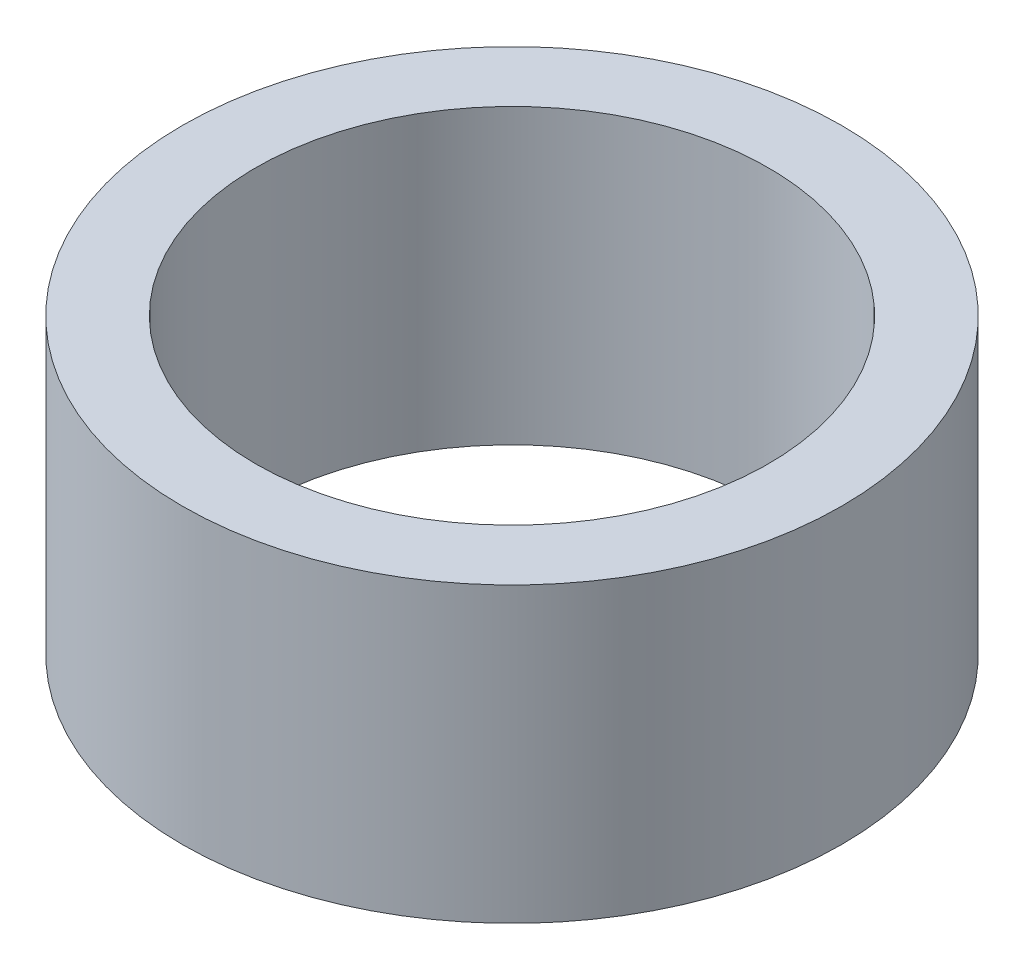
ISO-10303-21;
HEADER;
FILE_DESCRIPTION(('STEP AP214'),'2;1');
FILE_NAME('part.step','',(''),(''),'','','');
FILE_SCHEMA(('AUTOMOTIVE_DESIGN { 1 0 10303 214 1 1 1 1 }'));
ENDSEC;
DATA;
#1=APPLICATION_CONTEXT('core data for automotive mechanical design processes');
#2=APPLICATION_PROTOCOL_DEFINITION('international standard','automotive_design',2000,#1);
#3=PRODUCT_CONTEXT('',#1,'mechanical');
#4=PRODUCT('Part','Part','',(#3));
#5=PRODUCT_RELATED_PRODUCT_CATEGORY('part','',(#4));
#6=PRODUCT_DEFINITION_FORMATION('','',#4);
#7=PRODUCT_DEFINITION_CONTEXT('part definition',#1,'design');
#8=PRODUCT_DEFINITION('design','',#6,#7);
#9=PRODUCT_DEFINITION_SHAPE('','',#8);
#10=(LENGTH_UNIT() NAMED_UNIT(*) SI_UNIT(.MILLI.,.METRE.));
#11=(NAMED_UNIT(*) PLANE_ANGLE_UNIT() SI_UNIT($,.RADIAN.));
#12=(NAMED_UNIT(*) SI_UNIT($,.STERADIAN.) SOLID_ANGLE_UNIT());
#13=UNCERTAINTY_MEASURE_WITH_UNIT(LENGTH_MEASURE(1.E-05),#10,'distance_accuracy_value','');
#14=(GEOMETRIC_REPRESENTATION_CONTEXT(3) GLOBAL_UNCERTAINTY_ASSIGNED_CONTEXT((#13)) GLOBAL_UNIT_ASSIGNED_CONTEXT((#10,
#11,#12)) REPRESENTATION_CONTEXT('',''));
#15=CARTESIAN_POINT('',(0.,0.,0.));
#16=DIRECTION('',(0.,0.,1.));
#17=DIRECTION('',(1.,0.,0.));
#18=AXIS2_PLACEMENT_3D('',#15,#16,#17);
#19=CARTESIAN_POINT('',(0.,25.4,0.));
#20=DIRECTION('',(0.,1.,0.));
#21=DIRECTION('',(0.,0.,1.));
#22=AXIS2_PLACEMENT_3D('',#19,#20,#21);
#23=PLANE('',#22);
#24=CARTESIAN_POINT('',(0.,25.4,0.));
#25=DIRECTION('',(0.,1.,0.));
#26=DIRECTION('',(0.,0.,1.));
#27=AXIS2_PLACEMENT_3D('',#24,#25,#26);
#28=CIRCLE('',#27,28.575);
#29=CARTESIAN_POINT('',(0.,25.4,28.575));
#30=VERTEX_POINT('',#29);
#31=EDGE_CURVE('E10',#30,#30,#28,.T.);
#32=ORIENTED_EDGE('',*,*,#31,.T.);
#33=EDGE_LOOP('',(#32));
#34=FACE_BOUND('',#33,.T.);
#35=CARTESIAN_POINT('',(0.,25.4,0.));
#36=DIRECTION('',(0.,1.,0.));
#37=DIRECTION('',(0.,0.,1.));
#38=AXIS2_PLACEMENT_3D('',#35,#36,#37);
#39=CIRCLE('',#38,22.225);
#40=CARTESIAN_POINT('',(0.,25.4,22.225));
#41=VERTEX_POINT('',#40);
#42=EDGE_CURVE('E50',#41,#41,#39,.T.);
#43=ORIENTED_EDGE('',*,*,#42,.F.);
#44=EDGE_LOOP('',(#43));
#45=FACE_BOUND('',#44,.T.);
#46=ADVANCED_FACE('F39',(#34,#45),#23,.T.);
#47=CARTESIAN_POINT('',(0.,0.,0.));
#48=DIRECTION('',(0.,1.,0.));
#49=DIRECTION('',(0.,0.,1.));
#50=AXIS2_PLACEMENT_3D('',#47,#48,#49);
#51=PLANE('',#50);
#52=CARTESIAN_POINT('',(0.,0.,0.));
#53=DIRECTION('',(0.,1.,0.));
#54=DIRECTION('',(0.,0.,1.));
#55=AXIS2_PLACEMENT_3D('',#52,#53,#54);
#56=CIRCLE('',#55,28.575);
#57=CARTESIAN_POINT('',(0.,0.,28.575));
#58=VERTEX_POINT('',#57);
#59=EDGE_CURVE('E43',#58,#58,#56,.T.);
#60=ORIENTED_EDGE('',*,*,#59,.F.);
#61=EDGE_LOOP('',(#60));
#62=FACE_BOUND('',#61,.T.);
#63=CARTESIAN_POINT('',(0.,0.,0.));
#64=DIRECTION('',(0.,1.,0.));
#65=DIRECTION('',(0.,0.,1.));
#66=AXIS2_PLACEMENT_3D('',#63,#64,#65);
#67=CIRCLE('',#66,22.225);
#68=CARTESIAN_POINT('',(0.,0.,22.225));
#69=VERTEX_POINT('',#68);
#70=EDGE_CURVE('E52',#69,#69,#67,.T.);
#71=ORIENTED_EDGE('',*,*,#70,.T.);
#72=EDGE_LOOP('',(#71));
#73=FACE_BOUND('',#72,.T.);
#74=ADVANCED_FACE('F62',(#62,#73),#51,.F.);
#75=CARTESIAN_POINT('',(0.,25.4,0.));
#76=DIRECTION('',(0.,-1.,0.));
#77=DIRECTION('',(0.,0.,-1.));
#78=AXIS2_PLACEMENT_3D('',#75,#76,#77);
#79=CYLINDRICAL_SURFACE('',#78,28.575);
#80=ORIENTED_EDGE('',*,*,#31,.F.);
#81=EDGE_LOOP('',(#80));
#82=FACE_BOUND('',#81,.T.);
#83=ORIENTED_EDGE('',*,*,#59,.T.);
#84=EDGE_LOOP('',(#83));
#85=FACE_BOUND('',#84,.T.);
#86=ADVANCED_FACE('F41',(#82,#85),#79,.T.);
#87=CARTESIAN_POINT('',(0.,25.4,0.));
#88=DIRECTION('',(0.,-1.,0.));
#89=DIRECTION('',(0.,0.,-1.));
#90=AXIS2_PLACEMENT_3D('',#87,#88,#89);
#91=CYLINDRICAL_SURFACE('',#90,22.225);
#92=ORIENTED_EDGE('',*,*,#42,.T.);
#93=EDGE_LOOP('',(#92));
#94=FACE_BOUND('',#93,.T.);
#95=ORIENTED_EDGE('',*,*,#70,.F.);
#96=EDGE_LOOP('',(#95));
#97=FACE_BOUND('',#96,.T.);
#98=ADVANCED_FACE('F58',(#94,#97),#91,.F.);
#99=CLOSED_SHELL('',(#46,#74,#86,#98));
#100=MANIFOLD_SOLID_BREP('B2',#99);
#101=ADVANCED_BREP_SHAPE_REPRESENTATION('',(#18,#100),#14);
#102=SHAPE_DEFINITION_REPRESENTATION(#9,#101);
ENDSEC;
END-ISO-10303-21;
